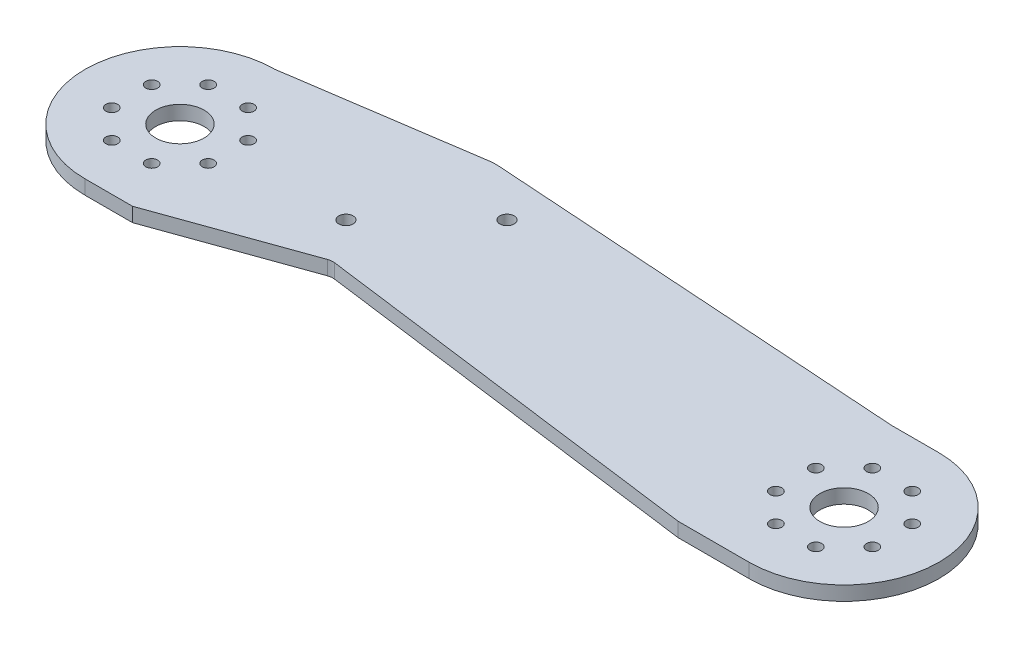
ISO-10303-21;
HEADER;
FILE_DESCRIPTION(('STEP AP214'),'2;1');
FILE_NAME('part.step','',(''),(''),'','','');
FILE_SCHEMA(('AUTOMOTIVE_DESIGN { 1 0 10303 214 1 1 1 1 }'));
ENDSEC;
DATA;
#1=APPLICATION_CONTEXT('core data for automotive mechanical design processes');
#2=APPLICATION_PROTOCOL_DEFINITION('international standard','automotive_design',2000,#1);
#3=PRODUCT_CONTEXT('',#1,'mechanical');
#4=PRODUCT('Part','Part','',(#3));
#5=PRODUCT_RELATED_PRODUCT_CATEGORY('part','',(#4));
#6=PRODUCT_DEFINITION_FORMATION('','',#4);
#7=PRODUCT_DEFINITION_CONTEXT('part definition',#1,'design');
#8=PRODUCT_DEFINITION('design','',#6,#7);
#9=PRODUCT_DEFINITION_SHAPE('','',#8);
#10=(LENGTH_UNIT() NAMED_UNIT(*) SI_UNIT(.MILLI.,.METRE.));
#11=(NAMED_UNIT(*) PLANE_ANGLE_UNIT() SI_UNIT($,.RADIAN.));
#12=(NAMED_UNIT(*) SI_UNIT($,.STERADIAN.) SOLID_ANGLE_UNIT());
#13=UNCERTAINTY_MEASURE_WITH_UNIT(LENGTH_MEASURE(1.E-05),#10,'distance_accuracy_value','');
#14=(GEOMETRIC_REPRESENTATION_CONTEXT(3) GLOBAL_UNCERTAINTY_ASSIGNED_CONTEXT((#13)) GLOBAL_UNIT_ASSIGNED_CONTEXT((#10,
#11,#12)) REPRESENTATION_CONTEXT('',''));
#15=CARTESIAN_POINT('',(0.,0.,0.));
#16=DIRECTION('',(0.,0.,1.));
#17=DIRECTION('',(1.,0.,0.));
#18=AXIS2_PLACEMENT_3D('',#15,#16,#17);
#19=CARTESIAN_POINT('',(-28.75,3.,11.9926406871193));
#20=DIRECTION('',(0.,1.,0.));
#21=DIRECTION('',(0.,0.,1.));
#22=AXIS2_PLACEMENT_3D('',#19,#20,#21);
#23=CYLINDRICAL_SURFACE('',#22,3.);
#24=CARTESIAN_POINT('',(-28.75,3.,11.9926406871193));
#25=DIRECTION('',(0.,1.,0.));
#26=DIRECTION('',(0.,0.,1.));
#27=AXIS2_PLACEMENT_3D('',#24,#25,#26);
#28=CIRCLE('',#27,3.);
#29=CARTESIAN_POINT('',(-29.7616784845072,3.,9.16836969375037));
#30=VERTEX_POINT('',#29);
#31=CARTESIAN_POINT('',(-28.3581636548757,3.,9.01834005022334));
#32=VERTEX_POINT('',#31);
#33=EDGE_CURVE('E174',#30,#32,#28,.F.);
#34=ORIENTED_EDGE('',*,*,#33,.F.);
#35=DIRECTION('',(0.,-1.,0.));
#36=VECTOR('',#35,1.);
#37=CARTESIAN_POINT('',(-29.7616784845072,10.,9.16836969375037));
#38=LINE('',#37,#36);
#39=CARTESIAN_POINT('',(-29.7616784845072,0.,9.16836969375037));
#40=VERTEX_POINT('',#39);
#41=EDGE_CURVE('E147',#30,#40,#38,.T.);
#42=ORIENTED_EDGE('',*,*,#41,.T.);
#43=CARTESIAN_POINT('',(-28.75,0.,11.9926406871193));
#44=DIRECTION('',(0.,1.,0.));
#45=DIRECTION('',(0.,0.,1.));
#46=AXIS2_PLACEMENT_3D('',#43,#44,#45);
#47=CIRCLE('',#46,3.);
#48=CARTESIAN_POINT('',(-28.3581636548757,0.,9.01834005022334));
#49=VERTEX_POINT('',#48);
#50=EDGE_CURVE('E146',#49,#40,#47,.T.);
#51=ORIENTED_EDGE('',*,*,#50,.F.);
#52=DIRECTION('',(0.,1.,0.));
#53=VECTOR('',#52,1.);
#54=CARTESIAN_POINT('',(-28.3581636548757,3.,9.01834005022334));
#55=LINE('',#54,#53);
#56=EDGE_CURVE('E134',#32,#49,#55,.F.);
#57=ORIENTED_EDGE('',*,*,#56,.F.);
#58=EDGE_LOOP('',(#34,#42,#51,#57));
#59=FACE_BOUND('',#58,.T.);
#60=ADVANCED_FACE('F33',(#59),#23,.F.);
#61=CARTESIAN_POINT('',(70.,3.,0.));
#62=DIRECTION('',(0.,1.,0.));
#63=DIRECTION('',(0.,0.,1.));
#64=AXIS2_PLACEMENT_3D('',#61,#62,#63);
#65=PLANE('',#64);
#66=DIRECTION('',(0.997771070846407,0.,0.0667299796344541));
#67=VECTOR('',#66,1.);
#68=CARTESIAN_POINT('',(-29.7141952968232,3.,-26.));
#69=LINE('',#68,#67);
#70=CARTESIAN_POINT('',(-28.6393146422383,3.,-25.9281130047907));
#71=VERTEX_POINT('',#70);
#72=CARTESIAN_POINT('',(59.6667223576861,3.,-20.0222892915359));
#73=VERTEX_POINT('',#72);
#74=EDGE_CURVE('E206',#71,#73,#69,.T.);
#75=ORIENTED_EDGE('',*,*,#74,.F.);
#76=CARTESIAN_POINT('',(-29.3066144385829,3.,-15.9504022963266));
#77=DIRECTION('',(0.,1.,0.));
#78=DIRECTION('',(0.,0.,1.));
#79=AXIS2_PLACEMENT_3D('',#76,#77,#78);
#80=CIRCLE('',#79,10.);
#81=CARTESIAN_POINT('',(-30.7797242349632,3.,-25.8413045568794));
#82=VERTEX_POINT('',#81);
#83=EDGE_CURVE('E56',#71,#82,#80,.T.);
#84=ORIENTED_EDGE('',*,*,#83,.T.);
#85=DIRECTION('',(0.989090226055278,0.,-0.14731097963804));
#86=VECTOR('',#85,1.);
#87=CARTESIAN_POINT('',(-69.9999999999998,3.,-20.));
#88=LINE('',#87,#86);
#89=CARTESIAN_POINT('',(-69.9999999999998,3.,-20.));
#90=VERTEX_POINT('',#89);
#91=EDGE_CURVE('E211',#90,#82,#88,.T.);
#92=ORIENTED_EDGE('',*,*,#91,.F.);
#93=CARTESIAN_POINT('',(-70.,3.,0.));
#94=DIRECTION('',(0.,1.,0.));
#95=DIRECTION('',(0.,0.,-1.));
#96=AXIS2_PLACEMENT_3D('',#93,#94,#95);
#97=CIRCLE('',#96,20.);
#98=CARTESIAN_POINT('',(-70.,3.,20.));
#99=VERTEX_POINT('',#98);
#100=EDGE_CURVE('E346',#90,#99,#97,.T.);
#101=ORIENTED_EDGE('',*,*,#100,.T.);
#102=DIRECTION('',(1.,0.,0.));
#103=VECTOR('',#102,1.);
#104=CARTESIAN_POINT('',(-70.,3.,20.));
#105=LINE('',#104,#103);
#106=CARTESIAN_POINT('',(-60.,3.,20.));
#107=VERTEX_POINT('',#106);
#108=EDGE_CURVE('E164',#99,#107,#105,.T.);
#109=ORIENTED_EDGE('',*,*,#108,.T.);
#110=DIRECTION('',(-0.94142366445631,0.,0.337226161502416));
#111=VECTOR('',#110,1.);
#112=CARTESIAN_POINT('',(61.5656608540279,3.,-23.5458792126112));
#113=LINE('',#112,#111);
#114=EDGE_CURVE('E128',#30,#107,#113,.T.);
#115=ORIENTED_EDGE('',*,*,#114,.F.);
#116=ORIENTED_EDGE('',*,*,#33,.T.);
#117=DIRECTION('',(-0.991433545631984,0.,-0.130612115041416));
#118=VECTOR('',#117,1.);
#119=CARTESIAN_POINT('',(67.154242484706,3.,21.6012079928582));
#120=LINE('',#119,#118);
#121=CARTESIAN_POINT('',(55.,3.,20.));
#122=VERTEX_POINT('',#121);
#123=EDGE_CURVE('E220',#122,#32,#120,.T.);
#124=ORIENTED_EDGE('',*,*,#123,.F.);
#125=DIRECTION('',(1.,0.,0.));
#126=VECTOR('',#125,1.);
#127=CARTESIAN_POINT('',(-16.5,3.,20.));
#128=LINE('',#127,#126);
#129=CARTESIAN_POINT('',(70.,3.,20.));
#130=VERTEX_POINT('',#129);
#131=EDGE_CURVE('E153',#122,#130,#128,.T.);
#132=ORIENTED_EDGE('',*,*,#131,.T.);
#133=CARTESIAN_POINT('',(70.,3.,0.));
#134=DIRECTION('',(0.,1.,0.));
#135=DIRECTION('',(0.,0.,1.));
#136=AXIS2_PLACEMENT_3D('',#133,#134,#135);
#137=CIRCLE('',#136,20.);
#138=CARTESIAN_POINT('',(70.,3.,-20.));
#139=VERTEX_POINT('',#138);
#140=EDGE_CURVE('E156',#130,#139,#137,.T.);
#141=ORIENTED_EDGE('',*,*,#140,.T.);
#142=DIRECTION('',(-1.,0.,0.));
#143=VECTOR('',#142,1.);
#144=CARTESIAN_POINT('',(70.,3.,-20.));
#145=LINE('',#144,#143);
#146=CARTESIAN_POINT('',(60.3340221540306,3.,-20.));
#147=VERTEX_POINT('',#146);
#148=EDGE_CURVE('E207',#139,#147,#145,.T.);
#149=ORIENTED_EDGE('',*,*,#148,.T.);
#150=CARTESIAN_POINT('',(60.3340221540306,3.,-30.));
#151=DIRECTION('',(0.,1.,0.));
#152=DIRECTION('',(0.,0.,1.));
#153=AXIS2_PLACEMENT_3D('',#150,#151,#152);
#154=CIRCLE('',#153,10.);
#155=EDGE_CURVE('E11',#147,#73,#154,.F.);
#156=ORIENTED_EDGE('',*,*,#155,.T.);
#157=EDGE_LOOP('',(#75,#84,#92,#101,#109,#115,#116,#124,#132,#141,#149,#156));
#158=FACE_BOUND('',#157,.T.);
#159=CARTESIAN_POINT('',(-35.,3.,0.));
#160=DIRECTION('',(0.,1.,0.));
#161=DIRECTION('',(0.,0.,1.));
#162=AXIS2_PLACEMENT_3D('',#159,#160,#161);
#163=CIRCLE('',#162,1.5);
#164=CARTESIAN_POINT('',(-35.,3.,1.5));
#165=VERTEX_POINT('',#164);
#166=EDGE_CURVE('E230',#165,#165,#163,.T.);
#167=ORIENTED_EDGE('',*,*,#166,.F.);
#168=EDGE_LOOP('',(#167));
#169=FACE_BOUND('',#168,.T.);
#170=CARTESIAN_POINT('',(-59.8373251423758,3.,-4.20951775601592));
#171=DIRECTION('',(0.,1.,0.));
#172=DIRECTION('',(0.,0.,-1.));
#173=AXIS2_PLACEMENT_3D('',#170,#171,#172);
#174=CIRCLE('',#173,1.24999999999998);
#175=CARTESIAN_POINT('',(-59.8373251423758,3.,-5.4595177560159));
#176=VERTEX_POINT('',#175);
#177=EDGE_CURVE('E242',#176,#176,#174,.T.);
#178=ORIENTED_EDGE('',*,*,#177,.F.);
#179=EDGE_LOOP('',(#178));
#180=FACE_BOUND('',#179,.T.);
#181=CARTESIAN_POINT('',(-74.2095177560159,3.,-10.1626748576242));
#182=DIRECTION('',(0.,1.,0.));
#183=DIRECTION('',(0.,0.,-1.));
#184=AXIS2_PLACEMENT_3D('',#181,#182,#183);
#185=CIRCLE('',#184,1.25000000000001);
#186=CARTESIAN_POINT('',(-74.2095177560159,3.,-11.4126748576242));
#187=VERTEX_POINT('',#186);
#188=EDGE_CURVE('E254',#187,#187,#185,.T.);
#189=ORIENTED_EDGE('',*,*,#188,.F.);
#190=EDGE_LOOP('',(#189));
#191=FACE_BOUND('',#190,.T.);
#192=CARTESIAN_POINT('',(65.7904822439841,3.,10.1626748576242));
#193=DIRECTION('',(0.,1.,0.));
#194=DIRECTION('',(0.,0.,1.));
#195=AXIS2_PLACEMENT_3D('',#192,#193,#194);
#196=CIRCLE('',#195,1.24999999999997);
#197=CARTESIAN_POINT('',(65.7904822439841,3.,11.4126748576241));
#198=VERTEX_POINT('',#197);
#199=EDGE_CURVE('E266',#198,#198,#196,.T.);
#200=ORIENTED_EDGE('',*,*,#199,.F.);
#201=EDGE_LOOP('',(#200));
#202=FACE_BOUND('',#201,.T.);
#203=CARTESIAN_POINT('',(-80.1626748576242,3.,4.20951775601592));
#204=DIRECTION('',(0.,1.,0.));
#205=DIRECTION('',(0.,0.,-1.));
#206=AXIS2_PLACEMENT_3D('',#203,#204,#205);
#207=CIRCLE('',#206,1.25000000000001);
#208=CARTESIAN_POINT('',(-80.1626748576242,3.,2.95951775601591));
#209=VERTEX_POINT('',#208);
#210=EDGE_CURVE('E278',#209,#209,#207,.T.);
#211=ORIENTED_EDGE('',*,*,#210,.F.);
#212=EDGE_LOOP('',(#211));
#213=FACE_BOUND('',#212,.T.);
#214=CARTESIAN_POINT('',(-65.7904822439841,3.,10.1626748576242));
#215=DIRECTION('',(0.,1.,0.));
#216=DIRECTION('',(0.,0.,-1.));
#217=AXIS2_PLACEMENT_3D('',#214,#215,#216);
#218=CIRCLE('',#217,1.24999999999997);
#219=CARTESIAN_POINT('',(-65.7904822439841,3.,8.91267485762421));
#220=VERTEX_POINT('',#219);
#221=EDGE_CURVE('E290',#220,#220,#218,.T.);
#222=ORIENTED_EDGE('',*,*,#221,.F.);
#223=EDGE_LOOP('',(#222));
#224=FACE_BOUND('',#223,.T.);
#225=CARTESIAN_POINT('',(74.2095177560161,3.,10.1626748576241));
#226=DIRECTION('',(0.,1.,0.));
#227=DIRECTION('',(0.,0.,1.));
#228=AXIS2_PLACEMENT_3D('',#225,#226,#227);
#229=CIRCLE('',#228,1.25000000000001);
#230=CARTESIAN_POINT('',(74.2095177560161,3.,11.4126748576241));
#231=VERTEX_POINT('',#230);
#232=EDGE_CURVE('E302',#231,#231,#229,.T.);
#233=ORIENTED_EDGE('',*,*,#232,.F.);
#234=EDGE_LOOP('',(#233));
#235=FACE_BOUND('',#234,.T.);
#236=CARTESIAN_POINT('',(80.1626748576241,3.,-4.20951775601604));
#237=DIRECTION('',(0.,1.,0.));
#238=DIRECTION('',(0.,0.,1.));
#239=AXIS2_PLACEMENT_3D('',#236,#237,#238);
#240=CIRCLE('',#239,1.25000000000004);
#241=CARTESIAN_POINT('',(80.1626748576241,3.,-2.959517756016));
#242=VERTEX_POINT('',#241);
#243=EDGE_CURVE('E314',#242,#242,#240,.T.);
#244=ORIENTED_EDGE('',*,*,#243,.F.);
#245=EDGE_LOOP('',(#244));
#246=FACE_BOUND('',#245,.T.);
#247=CARTESIAN_POINT('',(65.790482243984,3.,-10.1626748576241));
#248=DIRECTION('',(0.,1.,0.));
#249=DIRECTION('',(0.,0.,1.));
#250=AXIS2_PLACEMENT_3D('',#247,#248,#249);
#251=CIRCLE('',#250,1.25000000000001);
#252=CARTESIAN_POINT('',(65.790482243984,3.,-8.91267485762411));
#253=VERTEX_POINT('',#252);
#254=EDGE_CURVE('E326',#253,#253,#251,.T.);
#255=ORIENTED_EDGE('',*,*,#254,.F.);
#256=EDGE_LOOP('',(#255));
#257=FACE_BOUND('',#256,.T.);
#258=CARTESIAN_POINT('',(70.,3.,0.));
#259=DIRECTION('',(0.,1.,0.));
#260=DIRECTION('',(0.,0.,1.));
#261=AXIS2_PLACEMENT_3D('',#258,#259,#260);
#262=CIRCLE('',#261,5.09999999999998);
#263=CARTESIAN_POINT('',(70.,3.,5.09999999999998));
#264=VERTEX_POINT('',#263);
#265=EDGE_CURVE('E338',#264,#264,#262,.T.);
#266=ORIENTED_EDGE('',*,*,#265,.F.);
#267=EDGE_LOOP('',(#266));
#268=FACE_BOUND('',#267,.T.);
#269=CARTESIAN_POINT('',(59.8373251423758,3.,-4.20951775601592));
#270=DIRECTION('',(0.,1.,0.));
#271=DIRECTION('',(0.,0.,1.));
#272=AXIS2_PLACEMENT_3D('',#269,#270,#271);
#273=CIRCLE('',#272,1.24999999999998);
#274=CARTESIAN_POINT('',(59.8373251423758,3.,-2.95951775601594));
#275=VERTEX_POINT('',#274);
#276=EDGE_CURVE('E332',#275,#275,#273,.T.);
#277=ORIENTED_EDGE('',*,*,#276,.F.);
#278=EDGE_LOOP('',(#277));
#279=FACE_BOUND('',#278,.T.);
#280=CARTESIAN_POINT('',(74.2095177560159,3.,-10.1626748576242));
#281=DIRECTION('',(0.,1.,0.));
#282=DIRECTION('',(0.,0.,1.));
#283=AXIS2_PLACEMENT_3D('',#280,#281,#282);
#284=CIRCLE('',#283,1.25000000000001);
#285=CARTESIAN_POINT('',(74.2095177560159,3.,-8.91267485762416));
#286=VERTEX_POINT('',#285);
#287=EDGE_CURVE('E320',#286,#286,#284,.T.);
#288=ORIENTED_EDGE('',*,*,#287,.F.);
#289=EDGE_LOOP('',(#288));
#290=FACE_BOUND('',#289,.T.);
#291=CARTESIAN_POINT('',(80.1626748576242,3.,4.20951775601592));
#292=DIRECTION('',(0.,1.,0.));
#293=DIRECTION('',(0.,0.,1.));
#294=AXIS2_PLACEMENT_3D('',#291,#292,#293);
#295=CIRCLE('',#294,1.25000000000001);
#296=CARTESIAN_POINT('',(80.1626748576242,3.,5.45951775601593));
#297=VERTEX_POINT('',#296);
#298=EDGE_CURVE('E308',#297,#297,#295,.T.);
#299=ORIENTED_EDGE('',*,*,#298,.F.);
#300=EDGE_LOOP('',(#299));
#301=FACE_BOUND('',#300,.T.);
#302=CARTESIAN_POINT('',(-59.8373251423759,3.,4.20951775601605));
#303=DIRECTION('',(0.,1.,0.));
#304=DIRECTION('',(0.,0.,-1.));
#305=AXIS2_PLACEMENT_3D('',#302,#303,#304);
#306=CIRCLE('',#305,1.24999999999998);
#307=CARTESIAN_POINT('',(-59.8373251423759,3.,2.95951775601607));
#308=VERTEX_POINT('',#307);
#309=EDGE_CURVE('E296',#308,#308,#306,.T.);
#310=ORIENTED_EDGE('',*,*,#309,.F.);
#311=EDGE_LOOP('',(#310));
#312=FACE_BOUND('',#311,.T.);
#313=CARTESIAN_POINT('',(-74.2095177560161,3.,10.1626748576241));
#314=DIRECTION('',(0.,1.,0.));
#315=DIRECTION('',(0.,0.,-1.));
#316=AXIS2_PLACEMENT_3D('',#313,#314,#315);
#317=CIRCLE('',#316,1.25000000000001);
#318=CARTESIAN_POINT('',(-74.2095177560161,3.,8.91267485762411));
#319=VERTEX_POINT('',#318);
#320=EDGE_CURVE('E284',#319,#319,#317,.T.);
#321=ORIENTED_EDGE('',*,*,#320,.F.);
#322=EDGE_LOOP('',(#321));
#323=FACE_BOUND('',#322,.T.);
#324=CARTESIAN_POINT('',(-80.1626748576241,3.,-4.20951775601604));
#325=DIRECTION('',(0.,1.,0.));
#326=DIRECTION('',(0.,0.,-1.));
#327=AXIS2_PLACEMENT_3D('',#324,#325,#326);
#328=CIRCLE('',#327,1.25000000000004);
#329=CARTESIAN_POINT('',(-80.1626748576241,3.,-5.45951775601608));
#330=VERTEX_POINT('',#329);
#331=EDGE_CURVE('E272',#330,#330,#328,.T.);
#332=ORIENTED_EDGE('',*,*,#331,.F.);
#333=EDGE_LOOP('',(#332));
#334=FACE_BOUND('',#333,.T.);
#335=CARTESIAN_POINT('',(59.8373251423759,3.,4.20951775601605));
#336=DIRECTION('',(0.,1.,0.));
#337=DIRECTION('',(0.,0.,1.));
#338=AXIS2_PLACEMENT_3D('',#335,#336,#337);
#339=CIRCLE('',#338,1.24999999999998);
#340=CARTESIAN_POINT('',(59.8373251423759,3.,5.45951775601603));
#341=VERTEX_POINT('',#340);
#342=EDGE_CURVE('E260',#341,#341,#339,.T.);
#343=ORIENTED_EDGE('',*,*,#342,.F.);
#344=EDGE_LOOP('',(#343));
#345=FACE_BOUND('',#344,.T.);
#346=CARTESIAN_POINT('',(-65.790482243984,3.,-10.1626748576241));
#347=DIRECTION('',(0.,1.,0.));
#348=DIRECTION('',(0.,0.,-1.));
#349=AXIS2_PLACEMENT_3D('',#346,#347,#348);
#350=CIRCLE('',#349,1.25000000000001);
#351=CARTESIAN_POINT('',(-65.790482243984,3.,-11.4126748576241));
#352=VERTEX_POINT('',#351);
#353=EDGE_CURVE('E248',#352,#352,#350,.T.);
#354=ORIENTED_EDGE('',*,*,#353,.F.);
#355=EDGE_LOOP('',(#354));
#356=FACE_BOUND('',#355,.T.);
#357=CARTESIAN_POINT('',(-70.,3.,0.));
#358=DIRECTION('',(0.,1.,0.));
#359=DIRECTION('',(0.,0.,-1.));
#360=AXIS2_PLACEMENT_3D('',#357,#358,#359);
#361=CIRCLE('',#360,5.09999999999998);
#362=CARTESIAN_POINT('',(-70.,3.,-5.09999999999998));
#363=VERTEX_POINT('',#362);
#364=EDGE_CURVE('E236',#363,#363,#361,.T.);
#365=ORIENTED_EDGE('',*,*,#364,.F.);
#366=EDGE_LOOP('',(#365));
#367=FACE_BOUND('',#366,.T.);
#368=CARTESIAN_POINT('',(-18.0294372515229,3.,-16.9705627484772));
#369=DIRECTION('',(0.,1.,0.));
#370=DIRECTION('',(0.,0.,1.));
#371=AXIS2_PLACEMENT_3D('',#368,#369,#370);
#372=CIRCLE('',#371,1.5);
#373=CARTESIAN_POINT('',(-18.0294372515229,3.,-15.4705627484772));
#374=VERTEX_POINT('',#373);
#375=EDGE_CURVE('E224',#374,#374,#372,.T.);
#376=ORIENTED_EDGE('',*,*,#375,.F.);
#377=EDGE_LOOP('',(#376));
#378=FACE_BOUND('',#377,.T.);
#379=ADVANCED_FACE('F204',(#158,#169,#180,#191,#202,#213,#224,#235,#246,#257,#268,#279,#290,
#301,#312,#323,#334,#345,#356,#367,#378),#65,.T.);
#380=CARTESIAN_POINT('',(70.,0.,0.));
#381=DIRECTION('',(0.,1.,0.));
#382=DIRECTION('',(0.,0.,1.));
#383=AXIS2_PLACEMENT_3D('',#380,#381,#382);
#384=PLANE('',#383);
#385=DIRECTION('',(0.989090226055278,0.,-0.147310979638039));
#386=VECTOR('',#385,1.);
#387=CARTESIAN_POINT('',(-69.9999999999998,0.,-20.));
#388=LINE('',#387,#386);
#389=CARTESIAN_POINT('',(-70.,0.,-20.));
#390=VERTEX_POINT('',#389);
#391=CARTESIAN_POINT('',(-30.7797242349633,0.,-25.8413045568794));
#392=VERTEX_POINT('',#391);
#393=EDGE_CURVE('E365',#390,#392,#388,.T.);
#394=ORIENTED_EDGE('',*,*,#393,.T.);
#395=CARTESIAN_POINT('',(-29.3066144385829,0.,-15.9504022963266));
#396=DIRECTION('',(0.,1.,0.));
#397=DIRECTION('',(0.,0.,1.));
#398=AXIS2_PLACEMENT_3D('',#395,#396,#397);
#399=CIRCLE('',#398,10.);
#400=CARTESIAN_POINT('',(-28.6393146422383,0.,-25.9281130047907));
#401=VERTEX_POINT('',#400);
#402=EDGE_CURVE('E48',#392,#401,#399,.F.);
#403=ORIENTED_EDGE('',*,*,#402,.T.);
#404=DIRECTION('',(0.997771070846407,0.,0.0667299796344541));
#405=VECTOR('',#404,1.);
#406=CARTESIAN_POINT('',(-29.7141952968232,0.,-26.));
#407=LINE('',#406,#405);
#408=CARTESIAN_POINT('',(59.666722357686,0.,-20.0222892915359));
#409=VERTEX_POINT('',#408);
#410=EDGE_CURVE('E191',#401,#409,#407,.T.);
#411=ORIENTED_EDGE('',*,*,#410,.T.);
#412=CARTESIAN_POINT('',(60.3340221540306,0.,-30.));
#413=DIRECTION('',(0.,1.,0.));
#414=DIRECTION('',(0.,0.,1.));
#415=AXIS2_PLACEMENT_3D('',#412,#413,#414);
#416=CIRCLE('',#415,10.);
#417=CARTESIAN_POINT('',(60.3340221540306,0.,-20.));
#418=VERTEX_POINT('',#417);
#419=EDGE_CURVE('E41',#409,#418,#416,.T.);
#420=ORIENTED_EDGE('',*,*,#419,.T.);
#421=DIRECTION('',(-1.,0.,0.));
#422=VECTOR('',#421,1.);
#423=CARTESIAN_POINT('',(70.,0.,-20.));
#424=LINE('',#423,#422);
#425=CARTESIAN_POINT('',(70.,0.,-20.));
#426=VERTEX_POINT('',#425);
#427=EDGE_CURVE('E158',#426,#418,#424,.T.);
#428=ORIENTED_EDGE('',*,*,#427,.F.);
#429=CARTESIAN_POINT('',(70.,0.,0.));
#430=DIRECTION('',(0.,1.,0.));
#431=DIRECTION('',(0.,0.,1.));
#432=AXIS2_PLACEMENT_3D('',#429,#430,#431);
#433=CIRCLE('',#432,20.);
#434=CARTESIAN_POINT('',(70.,0.,20.));
#435=VERTEX_POINT('',#434);
#436=EDGE_CURVE('E200',#435,#426,#433,.T.);
#437=ORIENTED_EDGE('',*,*,#436,.F.);
#438=DIRECTION('',(1.,0.,0.));
#439=VECTOR('',#438,1.);
#440=CARTESIAN_POINT('',(-16.5,0.,20.));
#441=LINE('',#440,#439);
#442=CARTESIAN_POINT('',(55.,0.,20.));
#443=VERTEX_POINT('',#442);
#444=EDGE_CURVE('E341',#443,#435,#441,.T.);
#445=ORIENTED_EDGE('',*,*,#444,.F.);
#446=DIRECTION('',(0.991433545631984,0.,0.130612115041416));
#447=VECTOR('',#446,1.);
#448=CARTESIAN_POINT('',(-28.3581636548757,0.,9.01834005022334));
#449=LINE('',#448,#447);
#450=EDGE_CURVE('E210',#49,#443,#449,.T.);
#451=ORIENTED_EDGE('',*,*,#450,.F.);
#452=ORIENTED_EDGE('',*,*,#50,.T.);
#453=DIRECTION('',(0.94142366445631,0.,-0.337226161502416));
#454=VECTOR('',#453,1.);
#455=CARTESIAN_POINT('',(-29.7616784845072,0.,9.16836969375037));
#456=LINE('',#455,#454);
#457=CARTESIAN_POINT('',(-60.,0.,20.));
#458=VERTEX_POINT('',#457);
#459=EDGE_CURVE('E125',#458,#40,#456,.T.);
#460=ORIENTED_EDGE('',*,*,#459,.F.);
#461=DIRECTION('',(1.,0.,0.));
#462=VECTOR('',#461,1.);
#463=CARTESIAN_POINT('',(-70.,0.,20.));
#464=LINE('',#463,#462);
#465=CARTESIAN_POINT('',(-70.,0.,20.));
#466=VERTEX_POINT('',#465);
#467=EDGE_CURVE('E143',#466,#458,#464,.T.);
#468=ORIENTED_EDGE('',*,*,#467,.F.);
#469=CARTESIAN_POINT('',(-70.,0.,0.));
#470=DIRECTION('',(0.,1.,0.));
#471=DIRECTION('',(0.,0.,-1.));
#472=AXIS2_PLACEMENT_3D('',#469,#470,#471);
#473=CIRCLE('',#472,20.);
#474=EDGE_CURVE('E154',#390,#466,#473,.T.);
#475=ORIENTED_EDGE('',*,*,#474,.F.);
#476=EDGE_LOOP('',(#394,#403,#411,#420,#428,#437,#445,#451,#452,#460,#468,#475));
#477=FACE_BOUND('',#476,.T.);
#478=CARTESIAN_POINT('',(70.,0.,0.));
#479=DIRECTION('',(0.,1.,0.));
#480=DIRECTION('',(0.,0.,1.));
#481=AXIS2_PLACEMENT_3D('',#478,#479,#480);
#482=CIRCLE('',#481,5.09999999999998);
#483=CARTESIAN_POINT('',(70.,0.,5.09999999999998));
#484=VERTEX_POINT('',#483);
#485=EDGE_CURVE('E335',#484,#484,#482,.T.);
#486=ORIENTED_EDGE('',*,*,#485,.T.);
#487=EDGE_LOOP('',(#486));
#488=FACE_BOUND('',#487,.T.);
#489=CARTESIAN_POINT('',(59.8373251423758,0.,-4.20951775601592));
#490=DIRECTION('',(0.,1.,0.));
#491=DIRECTION('',(0.,0.,1.));
#492=AXIS2_PLACEMENT_3D('',#489,#490,#491);
#493=CIRCLE('',#492,1.24999999999998);
#494=CARTESIAN_POINT('',(59.8373251423758,0.,-2.95951775601594));
#495=VERTEX_POINT('',#494);
#496=EDGE_CURVE('E329',#495,#495,#493,.T.);
#497=ORIENTED_EDGE('',*,*,#496,.T.);
#498=EDGE_LOOP('',(#497));
#499=FACE_BOUND('',#498,.T.);
#500=CARTESIAN_POINT('',(65.790482243984,0.,-10.1626748576241));
#501=DIRECTION('',(0.,1.,0.));
#502=DIRECTION('',(0.,0.,1.));
#503=AXIS2_PLACEMENT_3D('',#500,#501,#502);
#504=CIRCLE('',#503,1.25000000000001);
#505=CARTESIAN_POINT('',(65.790482243984,0.,-8.91267485762411));
#506=VERTEX_POINT('',#505);
#507=EDGE_CURVE('E323',#506,#506,#504,.T.);
#508=ORIENTED_EDGE('',*,*,#507,.T.);
#509=EDGE_LOOP('',(#508));
#510=FACE_BOUND('',#509,.T.);
#511=CARTESIAN_POINT('',(74.2095177560159,0.,-10.1626748576242));
#512=DIRECTION('',(0.,1.,0.));
#513=DIRECTION('',(0.,0.,1.));
#514=AXIS2_PLACEMENT_3D('',#511,#512,#513);
#515=CIRCLE('',#514,1.25000000000001);
#516=CARTESIAN_POINT('',(74.2095177560159,0.,-8.91267485762416));
#517=VERTEX_POINT('',#516);
#518=EDGE_CURVE('E317',#517,#517,#515,.T.);
#519=ORIENTED_EDGE('',*,*,#518,.T.);
#520=EDGE_LOOP('',(#519));
#521=FACE_BOUND('',#520,.T.);
#522=CARTESIAN_POINT('',(80.1626748576241,0.,-4.20951775601604));
#523=DIRECTION('',(0.,1.,0.));
#524=DIRECTION('',(0.,0.,1.));
#525=AXIS2_PLACEMENT_3D('',#522,#523,#524);
#526=CIRCLE('',#525,1.25000000000004);
#527=CARTESIAN_POINT('',(80.1626748576241,0.,-2.959517756016));
#528=VERTEX_POINT('',#527);
#529=EDGE_CURVE('E311',#528,#528,#526,.T.);
#530=ORIENTED_EDGE('',*,*,#529,.T.);
#531=EDGE_LOOP('',(#530));
#532=FACE_BOUND('',#531,.T.);
#533=CARTESIAN_POINT('',(80.1626748576242,0.,4.20951775601592));
#534=DIRECTION('',(0.,1.,0.));
#535=DIRECTION('',(0.,0.,1.));
#536=AXIS2_PLACEMENT_3D('',#533,#534,#535);
#537=CIRCLE('',#536,1.25000000000001);
#538=CARTESIAN_POINT('',(80.1626748576242,0.,5.45951775601593));
#539=VERTEX_POINT('',#538);
#540=EDGE_CURVE('E305',#539,#539,#537,.T.);
#541=ORIENTED_EDGE('',*,*,#540,.T.);
#542=EDGE_LOOP('',(#541));
#543=FACE_BOUND('',#542,.T.);
#544=CARTESIAN_POINT('',(74.2095177560161,0.,10.1626748576241));
#545=DIRECTION('',(0.,1.,0.));
#546=DIRECTION('',(0.,0.,1.));
#547=AXIS2_PLACEMENT_3D('',#544,#545,#546);
#548=CIRCLE('',#547,1.25000000000001);
#549=CARTESIAN_POINT('',(74.2095177560161,0.,11.4126748576241));
#550=VERTEX_POINT('',#549);
#551=EDGE_CURVE('E299',#550,#550,#548,.T.);
#552=ORIENTED_EDGE('',*,*,#551,.T.);
#553=EDGE_LOOP('',(#552));
#554=FACE_BOUND('',#553,.T.);
#555=CARTESIAN_POINT('',(-59.8373251423759,0.,4.20951775601605));
#556=DIRECTION('',(0.,1.,0.));
#557=DIRECTION('',(0.,0.,-1.));
#558=AXIS2_PLACEMENT_3D('',#555,#556,#557);
#559=CIRCLE('',#558,1.24999999999998);
#560=CARTESIAN_POINT('',(-59.8373251423759,0.,2.95951775601607));
#561=VERTEX_POINT('',#560);
#562=EDGE_CURVE('E293',#561,#561,#559,.T.);
#563=ORIENTED_EDGE('',*,*,#562,.T.);
#564=EDGE_LOOP('',(#563));
#565=FACE_BOUND('',#564,.T.);
#566=CARTESIAN_POINT('',(-65.7904822439841,0.,10.1626748576242));
#567=DIRECTION('',(0.,1.,0.));
#568=DIRECTION('',(0.,0.,-1.));
#569=AXIS2_PLACEMENT_3D('',#566,#567,#568);
#570=CIRCLE('',#569,1.24999999999997);
#571=CARTESIAN_POINT('',(-65.7904822439841,0.,8.91267485762421));
#572=VERTEX_POINT('',#571);
#573=EDGE_CURVE('E287',#572,#572,#570,.T.);
#574=ORIENTED_EDGE('',*,*,#573,.T.);
#575=EDGE_LOOP('',(#574));
#576=FACE_BOUND('',#575,.T.);
#577=CARTESIAN_POINT('',(-74.2095177560161,0.,10.1626748576241));
#578=DIRECTION('',(0.,1.,0.));
#579=DIRECTION('',(0.,0.,-1.));
#580=AXIS2_PLACEMENT_3D('',#577,#578,#579);
#581=CIRCLE('',#580,1.25000000000001);
#582=CARTESIAN_POINT('',(-74.2095177560161,0.,8.91267485762411));
#583=VERTEX_POINT('',#582);
#584=EDGE_CURVE('E281',#583,#583,#581,.T.);
#585=ORIENTED_EDGE('',*,*,#584,.T.);
#586=EDGE_LOOP('',(#585));
#587=FACE_BOUND('',#586,.T.);
#588=CARTESIAN_POINT('',(-80.1626748576242,0.,4.20951775601592));
#589=DIRECTION('',(0.,1.,0.));
#590=DIRECTION('',(0.,0.,-1.));
#591=AXIS2_PLACEMENT_3D('',#588,#589,#590);
#592=CIRCLE('',#591,1.25000000000001);
#593=CARTESIAN_POINT('',(-80.1626748576242,0.,2.95951775601591));
#594=VERTEX_POINT('',#593);
#595=EDGE_CURVE('E275',#594,#594,#592,.T.);
#596=ORIENTED_EDGE('',*,*,#595,.T.);
#597=EDGE_LOOP('',(#596));
#598=FACE_BOUND('',#597,.T.);
#599=CARTESIAN_POINT('',(-80.1626748576241,0.,-4.20951775601604));
#600=DIRECTION('',(0.,1.,0.));
#601=DIRECTION('',(0.,0.,-1.));
#602=AXIS2_PLACEMENT_3D('',#599,#600,#601);
#603=CIRCLE('',#602,1.25000000000004);
#604=CARTESIAN_POINT('',(-80.1626748576241,0.,-5.45951775601608));
#605=VERTEX_POINT('',#604);
#606=EDGE_CURVE('E269',#605,#605,#603,.T.);
#607=ORIENTED_EDGE('',*,*,#606,.T.);
#608=EDGE_LOOP('',(#607));
#609=FACE_BOUND('',#608,.T.);
#610=CARTESIAN_POINT('',(65.7904822439841,0.,10.1626748576242));
#611=DIRECTION('',(0.,1.,0.));
#612=DIRECTION('',(0.,0.,1.));
#613=AXIS2_PLACEMENT_3D('',#610,#611,#612);
#614=CIRCLE('',#613,1.24999999999997);
#615=CARTESIAN_POINT('',(65.7904822439841,0.,11.4126748576241));
#616=VERTEX_POINT('',#615);
#617=EDGE_CURVE('E263',#616,#616,#614,.T.);
#618=ORIENTED_EDGE('',*,*,#617,.T.);
#619=EDGE_LOOP('',(#618));
#620=FACE_BOUND('',#619,.T.);
#621=CARTESIAN_POINT('',(59.8373251423759,0.,4.20951775601605));
#622=DIRECTION('',(0.,1.,0.));
#623=DIRECTION('',(0.,0.,1.));
#624=AXIS2_PLACEMENT_3D('',#621,#622,#623);
#625=CIRCLE('',#624,1.24999999999998);
#626=CARTESIAN_POINT('',(59.8373251423759,0.,5.45951775601603));
#627=VERTEX_POINT('',#626);
#628=EDGE_CURVE('E257',#627,#627,#625,.T.);
#629=ORIENTED_EDGE('',*,*,#628,.T.);
#630=EDGE_LOOP('',(#629));
#631=FACE_BOUND('',#630,.T.);
#632=CARTESIAN_POINT('',(-74.2095177560159,0.,-10.1626748576242));
#633=DIRECTION('',(0.,1.,0.));
#634=DIRECTION('',(0.,0.,-1.));
#635=AXIS2_PLACEMENT_3D('',#632,#633,#634);
#636=CIRCLE('',#635,1.25000000000001);
#637=CARTESIAN_POINT('',(-74.2095177560159,0.,-11.4126748576242));
#638=VERTEX_POINT('',#637);
#639=EDGE_CURVE('E251',#638,#638,#636,.T.);
#640=ORIENTED_EDGE('',*,*,#639,.T.);
#641=EDGE_LOOP('',(#640));
#642=FACE_BOUND('',#641,.T.);
#643=CARTESIAN_POINT('',(-65.790482243984,0.,-10.1626748576241));
#644=DIRECTION('',(0.,1.,0.));
#645=DIRECTION('',(0.,0.,-1.));
#646=AXIS2_PLACEMENT_3D('',#643,#644,#645);
#647=CIRCLE('',#646,1.25000000000001);
#648=CARTESIAN_POINT('',(-65.790482243984,0.,-11.4126748576241));
#649=VERTEX_POINT('',#648);
#650=EDGE_CURVE('E245',#649,#649,#647,.T.);
#651=ORIENTED_EDGE('',*,*,#650,.T.);
#652=EDGE_LOOP('',(#651));
#653=FACE_BOUND('',#652,.T.);
#654=CARTESIAN_POINT('',(-59.8373251423758,0.,-4.20951775601592));
#655=DIRECTION('',(0.,1.,0.));
#656=DIRECTION('',(0.,0.,-1.));
#657=AXIS2_PLACEMENT_3D('',#654,#655,#656);
#658=CIRCLE('',#657,1.24999999999998);
#659=CARTESIAN_POINT('',(-59.8373251423758,0.,-5.4595177560159));
#660=VERTEX_POINT('',#659);
#661=EDGE_CURVE('E239',#660,#660,#658,.T.);
#662=ORIENTED_EDGE('',*,*,#661,.T.);
#663=EDGE_LOOP('',(#662));
#664=FACE_BOUND('',#663,.T.);
#665=CARTESIAN_POINT('',(-70.,0.,0.));
#666=DIRECTION('',(0.,1.,0.));
#667=DIRECTION('',(0.,0.,-1.));
#668=AXIS2_PLACEMENT_3D('',#665,#666,#667);
#669=CIRCLE('',#668,5.09999999999998);
#670=CARTESIAN_POINT('',(-70.,0.,-5.09999999999998));
#671=VERTEX_POINT('',#670);
#672=EDGE_CURVE('E233',#671,#671,#669,.T.);
#673=ORIENTED_EDGE('',*,*,#672,.T.);
#674=EDGE_LOOP('',(#673));
#675=FACE_BOUND('',#674,.T.);
#676=CARTESIAN_POINT('',(-35.,0.,0.));
#677=DIRECTION('',(0.,1.,0.));
#678=DIRECTION('',(0.,0.,1.));
#679=AXIS2_PLACEMENT_3D('',#676,#677,#678);
#680=CIRCLE('',#679,1.5);
#681=CARTESIAN_POINT('',(-35.,0.,1.5));
#682=VERTEX_POINT('',#681);
#683=EDGE_CURVE('E227',#682,#682,#680,.T.);
#684=ORIENTED_EDGE('',*,*,#683,.T.);
#685=EDGE_LOOP('',(#684));
#686=FACE_BOUND('',#685,.T.);
#687=CARTESIAN_POINT('',(-18.0294372515229,0.,-16.9705627484772));
#688=DIRECTION('',(0.,1.,0.));
#689=DIRECTION('',(0.,0.,1.));
#690=AXIS2_PLACEMENT_3D('',#687,#688,#689);
#691=CIRCLE('',#690,1.5);
#692=CARTESIAN_POINT('',(-18.0294372515229,0.,-15.4705627484772));
#693=VERTEX_POINT('',#692);
#694=EDGE_CURVE('E223',#693,#693,#691,.T.);
#695=ORIENTED_EDGE('',*,*,#694,.T.);
#696=EDGE_LOOP('',(#695));
#697=FACE_BOUND('',#696,.T.);
#698=ADVANCED_FACE('F140',(#477,#488,#499,#510,#521,#532,#543,#554,#565,#576,#587,#598,#609,
#620,#631,#642,#653,#664,#675,#686,#697),#384,.F.);
#699=CARTESIAN_POINT('',(-16.5,3.,20.));
#700=DIRECTION('',(0.,0.,-1.));
#701=DIRECTION('',(-1.,0.,0.));
#702=AXIS2_PLACEMENT_3D('',#699,#700,#701);
#703=PLANE('',#702);
#704=ORIENTED_EDGE('',*,*,#131,.F.);
#705=DIRECTION('',(0.,-1.,0.));
#706=VECTOR('',#705,1.);
#707=CARTESIAN_POINT('',(55.,10.,20.));
#708=LINE('',#707,#706);
#709=EDGE_CURVE('E213',#122,#443,#708,.T.);
#710=ORIENTED_EDGE('',*,*,#709,.T.);
#711=ORIENTED_EDGE('',*,*,#444,.T.);
#712=DIRECTION('',(0.,-1.,0.));
#713=VECTOR('',#712,1.);
#714=CARTESIAN_POINT('',(70.,3.,20.));
#715=LINE('',#714,#713);
#716=EDGE_CURVE('E170',#130,#435,#715,.T.);
#717=ORIENTED_EDGE('',*,*,#716,.F.);
#718=EDGE_LOOP('',(#704,#710,#711,#717));
#719=FACE_BOUND('',#718,.T.);
#720=ADVANCED_FACE('F357',(#719),#703,.F.);
#721=CARTESIAN_POINT('',(70.,3.,0.));
#722=DIRECTION('',(0.,-1.,0.));
#723=DIRECTION('',(0.,0.,-1.));
#724=AXIS2_PLACEMENT_3D('',#721,#722,#723);
#725=CYLINDRICAL_SURFACE('',#724,20.);
#726=ORIENTED_EDGE('',*,*,#436,.T.);
#727=DIRECTION('',(0.,-1.,0.));
#728=VECTOR('',#727,1.);
#729=CARTESIAN_POINT('',(70.,3.,-20.));
#730=LINE('',#729,#728);
#731=EDGE_CURVE('E167',#139,#426,#730,.T.);
#732=ORIENTED_EDGE('',*,*,#731,.F.);
#733=ORIENTED_EDGE('',*,*,#140,.F.);
#734=ORIENTED_EDGE('',*,*,#716,.T.);
#735=EDGE_LOOP('',(#726,#732,#733,#734));
#736=FACE_BOUND('',#735,.T.);
#737=ADVANCED_FACE('F351',(#736),#725,.T.);
#738=CARTESIAN_POINT('',(70.,3.,-20.));
#739=DIRECTION('',(0.,0.,1.));
#740=DIRECTION('',(1.,0.,0.));
#741=AXIS2_PLACEMENT_3D('',#738,#739,#740);
#742=PLANE('',#741);
#743=ORIENTED_EDGE('',*,*,#427,.T.);
#744=DIRECTION('',(0.,-1.,0.));
#745=VECTOR('',#744,1.);
#746=CARTESIAN_POINT('',(60.3340221540306,3.,-20.));
#747=LINE('',#746,#745);
#748=EDGE_CURVE('E181',#418,#147,#747,.F.);
#749=ORIENTED_EDGE('',*,*,#748,.T.);
#750=ORIENTED_EDGE('',*,*,#148,.F.);
#751=ORIENTED_EDGE('',*,*,#731,.T.);
#752=EDGE_LOOP('',(#743,#749,#750,#751));
#753=FACE_BOUND('',#752,.T.);
#754=ADVANCED_FACE('F196',(#753),#742,.F.);
#755=CARTESIAN_POINT('',(-70.,3.,0.));
#756=DIRECTION('',(0.,-1.,0.));
#757=DIRECTION('',(0.,0.,-1.));
#758=AXIS2_PLACEMENT_3D('',#755,#756,#757);
#759=CYLINDRICAL_SURFACE('',#758,20.);
#760=ORIENTED_EDGE('',*,*,#474,.T.);
#761=DIRECTION('',(0.,-1.,0.));
#762=VECTOR('',#761,1.);
#763=CARTESIAN_POINT('',(-70.,3.,20.));
#764=LINE('',#763,#762);
#765=EDGE_CURVE('E152',#99,#466,#764,.T.);
#766=ORIENTED_EDGE('',*,*,#765,.F.);
#767=ORIENTED_EDGE('',*,*,#100,.F.);
#768=DIRECTION('',(0.,-1.,0.));
#769=VECTOR('',#768,1.);
#770=CARTESIAN_POINT('',(-70.,3.,-20.));
#771=LINE('',#770,#769);
#772=EDGE_CURVE('E163',#90,#390,#771,.T.);
#773=ORIENTED_EDGE('',*,*,#772,.T.);
#774=EDGE_LOOP('',(#760,#766,#767,#773));
#775=FACE_BOUND('',#774,.T.);
#776=ADVANCED_FACE('F373',(#775),#759,.T.);
#777=CARTESIAN_POINT('',(-70.,3.,20.));
#778=DIRECTION('',(0.,0.,-1.));
#779=DIRECTION('',(-1.,0.,0.));
#780=AXIS2_PLACEMENT_3D('',#777,#778,#779);
#781=PLANE('',#780);
#782=ORIENTED_EDGE('',*,*,#467,.T.);
#783=DIRECTION('',(0.,1.,0.));
#784=VECTOR('',#783,1.);
#785=CARTESIAN_POINT('',(-60.,3.,20.));
#786=LINE('',#785,#784);
#787=EDGE_CURVE('E122',#458,#107,#786,.T.);
#788=ORIENTED_EDGE('',*,*,#787,.T.);
#789=ORIENTED_EDGE('',*,*,#108,.F.);
#790=ORIENTED_EDGE('',*,*,#765,.T.);
#791=EDGE_LOOP('',(#782,#788,#789,#790));
#792=FACE_BOUND('',#791,.T.);
#793=ADVANCED_FACE('F150',(#792),#781,.F.);
#794=CARTESIAN_POINT('',(70.,3.,0.));
#795=DIRECTION('',(0.,-1.,0.));
#796=DIRECTION('',(0.,0.,-1.));
#797=AXIS2_PLACEMENT_3D('',#794,#795,#796);
#798=CYLINDRICAL_SURFACE('',#797,5.09999999999998);
#799=ORIENTED_EDGE('',*,*,#265,.T.);
#800=EDGE_LOOP('',(#799));
#801=FACE_BOUND('',#800,.T.);
#802=ORIENTED_EDGE('',*,*,#485,.F.);
#803=EDGE_LOOP('',(#802));
#804=FACE_BOUND('',#803,.T.);
#805=ADVANCED_FACE('F395',(#801,#804),#798,.F.);
#806=CARTESIAN_POINT('',(59.8373251423758,3.,-4.20951775601592));
#807=DIRECTION('',(0.,-1.,0.));
#808=DIRECTION('',(0.,0.,-1.));
#809=AXIS2_PLACEMENT_3D('',#806,#807,#808);
#810=CYLINDRICAL_SURFACE('',#809,1.24999999999998);
#811=ORIENTED_EDGE('',*,*,#276,.T.);
#812=EDGE_LOOP('',(#811));
#813=FACE_BOUND('',#812,.T.);
#814=ORIENTED_EDGE('',*,*,#496,.F.);
#815=EDGE_LOOP('',(#814));
#816=FACE_BOUND('',#815,.T.);
#817=ADVANCED_FACE('F400',(#813,#816),#810,.F.);
#818=CARTESIAN_POINT('',(65.790482243984,3.,-10.1626748576241));
#819=DIRECTION('',(0.,-1.,0.));
#820=DIRECTION('',(0.,0.,-1.));
#821=AXIS2_PLACEMENT_3D('',#818,#819,#820);
#822=CYLINDRICAL_SURFACE('',#821,1.25000000000001);
#823=ORIENTED_EDGE('',*,*,#254,.T.);
#824=EDGE_LOOP('',(#823));
#825=FACE_BOUND('',#824,.T.);
#826=ORIENTED_EDGE('',*,*,#507,.F.);
#827=EDGE_LOOP('',(#826));
#828=FACE_BOUND('',#827,.T.);
#829=ADVANCED_FACE('F404',(#825,#828),#822,.F.);
#830=CARTESIAN_POINT('',(74.2095177560159,3.,-10.1626748576242));
#831=DIRECTION('',(0.,-1.,0.));
#832=DIRECTION('',(0.,0.,-1.));
#833=AXIS2_PLACEMENT_3D('',#830,#831,#832);
#834=CYLINDRICAL_SURFACE('',#833,1.25000000000001);
#835=ORIENTED_EDGE('',*,*,#287,.T.);
#836=EDGE_LOOP('',(#835));
#837=FACE_BOUND('',#836,.T.);
#838=ORIENTED_EDGE('',*,*,#518,.F.);
#839=EDGE_LOOP('',(#838));
#840=FACE_BOUND('',#839,.T.);
#841=ADVANCED_FACE('F408',(#837,#840),#834,.F.);
#842=CARTESIAN_POINT('',(80.1626748576241,3.,-4.20951775601604));
#843=DIRECTION('',(0.,-1.,0.));
#844=DIRECTION('',(0.,0.,-1.));
#845=AXIS2_PLACEMENT_3D('',#842,#843,#844);
#846=CYLINDRICAL_SURFACE('',#845,1.25000000000004);
#847=ORIENTED_EDGE('',*,*,#243,.T.);
#848=EDGE_LOOP('',(#847));
#849=FACE_BOUND('',#848,.T.);
#850=ORIENTED_EDGE('',*,*,#529,.F.);
#851=EDGE_LOOP('',(#850));
#852=FACE_BOUND('',#851,.T.);
#853=ADVANCED_FACE('F412',(#849,#852),#846,.F.);
#854=CARTESIAN_POINT('',(80.1626748576242,3.,4.20951775601592));
#855=DIRECTION('',(0.,-1.,0.));
#856=DIRECTION('',(0.,0.,-1.));
#857=AXIS2_PLACEMENT_3D('',#854,#855,#856);
#858=CYLINDRICAL_SURFACE('',#857,1.25000000000001);
#859=ORIENTED_EDGE('',*,*,#298,.T.);
#860=EDGE_LOOP('',(#859));
#861=FACE_BOUND('',#860,.T.);
#862=ORIENTED_EDGE('',*,*,#540,.F.);
#863=EDGE_LOOP('',(#862));
#864=FACE_BOUND('',#863,.T.);
#865=ADVANCED_FACE('F416',(#861,#864),#858,.F.);
#866=CARTESIAN_POINT('',(74.2095177560161,3.,10.1626748576241));
#867=DIRECTION('',(0.,-1.,0.));
#868=DIRECTION('',(0.,0.,-1.));
#869=AXIS2_PLACEMENT_3D('',#866,#867,#868);
#870=CYLINDRICAL_SURFACE('',#869,1.25000000000001);
#871=ORIENTED_EDGE('',*,*,#232,.T.);
#872=EDGE_LOOP('',(#871));
#873=FACE_BOUND('',#872,.T.);
#874=ORIENTED_EDGE('',*,*,#551,.F.);
#875=EDGE_LOOP('',(#874));
#876=FACE_BOUND('',#875,.T.);
#877=ADVANCED_FACE('F420',(#873,#876),#870,.F.);
#878=CARTESIAN_POINT('',(-59.8373251423759,3.,4.20951775601605));
#879=DIRECTION('',(0.,-1.,0.));
#880=DIRECTION('',(0.,0.,-1.));
#881=AXIS2_PLACEMENT_3D('',#878,#879,#880);
#882=CYLINDRICAL_SURFACE('',#881,1.24999999999998);
#883=ORIENTED_EDGE('',*,*,#309,.T.);
#884=EDGE_LOOP('',(#883));
#885=FACE_BOUND('',#884,.T.);
#886=ORIENTED_EDGE('',*,*,#562,.F.);
#887=EDGE_LOOP('',(#886));
#888=FACE_BOUND('',#887,.T.);
#889=ADVANCED_FACE('F424',(#885,#888),#882,.F.);
#890=CARTESIAN_POINT('',(-65.7904822439841,3.,10.1626748576242));
#891=DIRECTION('',(0.,-1.,0.));
#892=DIRECTION('',(0.,0.,-1.));
#893=AXIS2_PLACEMENT_3D('',#890,#891,#892);
#894=CYLINDRICAL_SURFACE('',#893,1.24999999999997);
#895=ORIENTED_EDGE('',*,*,#221,.T.);
#896=EDGE_LOOP('',(#895));
#897=FACE_BOUND('',#896,.T.);
#898=ORIENTED_EDGE('',*,*,#573,.F.);
#899=EDGE_LOOP('',(#898));
#900=FACE_BOUND('',#899,.T.);
#901=ADVANCED_FACE('F428',(#897,#900),#894,.F.);
#902=CARTESIAN_POINT('',(-74.2095177560161,3.,10.1626748576241));
#903=DIRECTION('',(0.,-1.,0.));
#904=DIRECTION('',(0.,0.,-1.));
#905=AXIS2_PLACEMENT_3D('',#902,#903,#904);
#906=CYLINDRICAL_SURFACE('',#905,1.25000000000001);
#907=ORIENTED_EDGE('',*,*,#320,.T.);
#908=EDGE_LOOP('',(#907));
#909=FACE_BOUND('',#908,.T.);
#910=ORIENTED_EDGE('',*,*,#584,.F.);
#911=EDGE_LOOP('',(#910));
#912=FACE_BOUND('',#911,.T.);
#913=ADVANCED_FACE('F432',(#909,#912),#906,.F.);
#914=CARTESIAN_POINT('',(-80.1626748576242,3.,4.20951775601592));
#915=DIRECTION('',(0.,-1.,0.));
#916=DIRECTION('',(0.,0.,-1.));
#917=AXIS2_PLACEMENT_3D('',#914,#915,#916);
#918=CYLINDRICAL_SURFACE('',#917,1.25000000000001);
#919=ORIENTED_EDGE('',*,*,#210,.T.);
#920=EDGE_LOOP('',(#919));
#921=FACE_BOUND('',#920,.T.);
#922=ORIENTED_EDGE('',*,*,#595,.F.);
#923=EDGE_LOOP('',(#922));
#924=FACE_BOUND('',#923,.T.);
#925=ADVANCED_FACE('F436',(#921,#924),#918,.F.);
#926=CARTESIAN_POINT('',(-80.1626748576241,3.,-4.20951775601604));
#927=DIRECTION('',(0.,-1.,0.));
#928=DIRECTION('',(0.,0.,-1.));
#929=AXIS2_PLACEMENT_3D('',#926,#927,#928);
#930=CYLINDRICAL_SURFACE('',#929,1.25000000000004);
#931=ORIENTED_EDGE('',*,*,#331,.T.);
#932=EDGE_LOOP('',(#931));
#933=FACE_BOUND('',#932,.T.);
#934=ORIENTED_EDGE('',*,*,#606,.F.);
#935=EDGE_LOOP('',(#934));
#936=FACE_BOUND('',#935,.T.);
#937=ADVANCED_FACE('F440',(#933,#936),#930,.F.);
#938=CARTESIAN_POINT('',(65.7904822439841,3.,10.1626748576242));
#939=DIRECTION('',(0.,-1.,0.));
#940=DIRECTION('',(0.,0.,-1.));
#941=AXIS2_PLACEMENT_3D('',#938,#939,#940);
#942=CYLINDRICAL_SURFACE('',#941,1.24999999999997);
#943=ORIENTED_EDGE('',*,*,#199,.T.);
#944=EDGE_LOOP('',(#943));
#945=FACE_BOUND('',#944,.T.);
#946=ORIENTED_EDGE('',*,*,#617,.F.);
#947=EDGE_LOOP('',(#946));
#948=FACE_BOUND('',#947,.T.);
#949=ADVANCED_FACE('F444',(#945,#948),#942,.F.);
#950=CARTESIAN_POINT('',(59.8373251423759,3.,4.20951775601605));
#951=DIRECTION('',(0.,-1.,0.));
#952=DIRECTION('',(0.,0.,-1.));
#953=AXIS2_PLACEMENT_3D('',#950,#951,#952);
#954=CYLINDRICAL_SURFACE('',#953,1.24999999999998);
#955=ORIENTED_EDGE('',*,*,#342,.T.);
#956=EDGE_LOOP('',(#955));
#957=FACE_BOUND('',#956,.T.);
#958=ORIENTED_EDGE('',*,*,#628,.F.);
#959=EDGE_LOOP('',(#958));
#960=FACE_BOUND('',#959,.T.);
#961=ADVANCED_FACE('F448',(#957,#960),#954,.F.);
#962=CARTESIAN_POINT('',(-74.2095177560159,3.,-10.1626748576242));
#963=DIRECTION('',(0.,-1.,0.));
#964=DIRECTION('',(0.,0.,-1.));
#965=AXIS2_PLACEMENT_3D('',#962,#963,#964);
#966=CYLINDRICAL_SURFACE('',#965,1.25000000000001);
#967=ORIENTED_EDGE('',*,*,#188,.T.);
#968=EDGE_LOOP('',(#967));
#969=FACE_BOUND('',#968,.T.);
#970=ORIENTED_EDGE('',*,*,#639,.F.);
#971=EDGE_LOOP('',(#970));
#972=FACE_BOUND('',#971,.T.);
#973=ADVANCED_FACE('F452',(#969,#972),#966,.F.);
#974=CARTESIAN_POINT('',(-65.790482243984,3.,-10.1626748576241));
#975=DIRECTION('',(0.,-1.,0.));
#976=DIRECTION('',(0.,0.,-1.));
#977=AXIS2_PLACEMENT_3D('',#974,#975,#976);
#978=CYLINDRICAL_SURFACE('',#977,1.25000000000001);
#979=ORIENTED_EDGE('',*,*,#353,.T.);
#980=EDGE_LOOP('',(#979));
#981=FACE_BOUND('',#980,.T.);
#982=ORIENTED_EDGE('',*,*,#650,.F.);
#983=EDGE_LOOP('',(#982));
#984=FACE_BOUND('',#983,.T.);
#985=ADVANCED_FACE('F456',(#981,#984),#978,.F.);
#986=CARTESIAN_POINT('',(-59.8373251423758,3.,-4.20951775601592));
#987=DIRECTION('',(0.,-1.,0.));
#988=DIRECTION('',(0.,0.,-1.));
#989=AXIS2_PLACEMENT_3D('',#986,#987,#988);
#990=CYLINDRICAL_SURFACE('',#989,1.24999999999998);
#991=ORIENTED_EDGE('',*,*,#177,.T.);
#992=EDGE_LOOP('',(#991));
#993=FACE_BOUND('',#992,.T.);
#994=ORIENTED_EDGE('',*,*,#661,.F.);
#995=EDGE_LOOP('',(#994));
#996=FACE_BOUND('',#995,.T.);
#997=ADVANCED_FACE('F460',(#993,#996),#990,.F.);
#998=CARTESIAN_POINT('',(-70.,3.,0.));
#999=DIRECTION('',(0.,-1.,0.));
#1000=DIRECTION('',(0.,0.,-1.));
#1001=AXIS2_PLACEMENT_3D('',#998,#999,#1000);
#1002=CYLINDRICAL_SURFACE('',#1001,5.09999999999998);
#1003=ORIENTED_EDGE('',*,*,#364,.T.);
#1004=EDGE_LOOP('',(#1003));
#1005=FACE_BOUND('',#1004,.T.);
#1006=ORIENTED_EDGE('',*,*,#672,.F.);
#1007=EDGE_LOOP('',(#1006));
#1008=FACE_BOUND('',#1007,.T.);
#1009=ADVANCED_FACE('F464',(#1005,#1008),#1002,.F.);
#1010=CARTESIAN_POINT('',(-35.,3.,0.));
#1011=DIRECTION('',(0.,-1.,0.));
#1012=DIRECTION('',(0.,0.,-1.));
#1013=AXIS2_PLACEMENT_3D('',#1010,#1011,#1012);
#1014=CYLINDRICAL_SURFACE('',#1013,1.5);
#1015=ORIENTED_EDGE('',*,*,#166,.T.);
#1016=EDGE_LOOP('',(#1015));
#1017=FACE_BOUND('',#1016,.T.);
#1018=ORIENTED_EDGE('',*,*,#683,.F.);
#1019=EDGE_LOOP('',(#1018));
#1020=FACE_BOUND('',#1019,.T.);
#1021=ADVANCED_FACE('F468',(#1017,#1020),#1014,.F.);
#1022=CARTESIAN_POINT('',(-18.0294372515229,3.,-16.9705627484772));
#1023=DIRECTION('',(0.,-1.,0.));
#1024=DIRECTION('',(0.,0.,-1.));
#1025=AXIS2_PLACEMENT_3D('',#1022,#1023,#1024);
#1026=CYLINDRICAL_SURFACE('',#1025,1.5);
#1027=ORIENTED_EDGE('',*,*,#375,.T.);
#1028=EDGE_LOOP('',(#1027));
#1029=FACE_BOUND('',#1028,.T.);
#1030=ORIENTED_EDGE('',*,*,#694,.F.);
#1031=EDGE_LOOP('',(#1030));
#1032=FACE_BOUND('',#1031,.T.);
#1033=ADVANCED_FACE('F472',(#1029,#1032),#1026,.F.);
#1034=CARTESIAN_POINT('',(-28.3581636548757,10.,9.01834005022334));
#1035=DIRECTION('',(0.130612115041416,0.,-0.991433545631984));
#1036=DIRECTION('',(-0.991433545631984,0.,-0.130612115041416));
#1037=AXIS2_PLACEMENT_3D('',#1034,#1035,#1036);
#1038=PLANE('',#1037);
#1039=ORIENTED_EDGE('',*,*,#123,.T.);
#1040=ORIENTED_EDGE('',*,*,#56,.T.);
#1041=ORIENTED_EDGE('',*,*,#450,.T.);
#1042=ORIENTED_EDGE('',*,*,#709,.F.);
#1043=EDGE_LOOP('',(#1039,#1040,#1041,#1042));
#1044=FACE_BOUND('',#1043,.T.);
#1045=ADVANCED_FACE('F360',(#1044),#1038,.F.);
#1046=CARTESIAN_POINT('',(-69.9999999999998,133.138387879979,-20.));
#1047=DIRECTION('',(-0.14731097963804,0.,-0.989090226055278));
#1048=DIRECTION('',(-0.989090226055278,0.,0.14731097963804));
#1049=AXIS2_PLACEMENT_3D('',#1046,#1047,#1048);
#1050=PLANE('',#1049);
#1051=ORIENTED_EDGE('',*,*,#91,.T.);
#1052=DIRECTION('',(0.,-1.,0.));
#1053=VECTOR('',#1052,1.);
#1054=CARTESIAN_POINT('',(-30.7797242349633,133.138387879979,-25.8413045568794));
#1055=LINE('',#1054,#1053);
#1056=EDGE_CURVE('E183',#82,#392,#1055,.T.);
#1057=ORIENTED_EDGE('',*,*,#1056,.T.);
#1058=ORIENTED_EDGE('',*,*,#393,.F.);
#1059=ORIENTED_EDGE('',*,*,#772,.F.);
#1060=EDGE_LOOP('',(#1051,#1057,#1058,#1059));
#1061=FACE_BOUND('',#1060,.T.);
#1062=ADVANCED_FACE('F370',(#1061),#1050,.T.);
#1063=CARTESIAN_POINT('',(-29.7141952968232,133.138387879979,-26.));
#1064=DIRECTION('',(0.0667299796344541,0.,-0.997771070846407));
#1065=DIRECTION('',(-0.997771070846407,0.,-0.0667299796344541));
#1066=AXIS2_PLACEMENT_3D('',#1063,#1064,#1065);
#1067=PLANE('',#1066);
#1068=ORIENTED_EDGE('',*,*,#74,.T.);
#1069=DIRECTION('',(0.,-1.,0.));
#1070=VECTOR('',#1069,1.);
#1071=CARTESIAN_POINT('',(59.666722357686,133.138387879979,-20.0222892915359));
#1072=LINE('',#1071,#1070);
#1073=EDGE_CURVE('E178',#73,#409,#1072,.T.);
#1074=ORIENTED_EDGE('',*,*,#1073,.T.);
#1075=ORIENTED_EDGE('',*,*,#410,.F.);
#1076=DIRECTION('',(0.,-1.,0.));
#1077=VECTOR('',#1076,1.);
#1078=CARTESIAN_POINT('',(-28.6393146422383,133.138387879979,-25.9281130047907));
#1079=LINE('',#1078,#1077);
#1080=EDGE_CURVE('E133',#401,#71,#1079,.F.);
#1081=ORIENTED_EDGE('',*,*,#1080,.T.);
#1082=EDGE_LOOP('',(#1068,#1074,#1075,#1081));
#1083=FACE_BOUND('',#1082,.T.);
#1084=ADVANCED_FACE('F209',(#1083),#1067,.T.);
#1085=CARTESIAN_POINT('',(-29.7616784845072,10.,9.16836969375037));
#1086=DIRECTION('',(-0.337226161502416,0.,-0.94142366445631));
#1087=DIRECTION('',(-0.94142366445631,0.,0.337226161502416));
#1088=AXIS2_PLACEMENT_3D('',#1085,#1086,#1087);
#1089=PLANE('',#1088);
#1090=ORIENTED_EDGE('',*,*,#114,.T.);
#1091=ORIENTED_EDGE('',*,*,#787,.F.);
#1092=ORIENTED_EDGE('',*,*,#459,.T.);
#1093=ORIENTED_EDGE('',*,*,#41,.F.);
#1094=EDGE_LOOP('',(#1090,#1091,#1092,#1093));
#1095=FACE_BOUND('',#1094,.T.);
#1096=ADVANCED_FACE('F124',(#1095),#1089,.F.);
#1097=CARTESIAN_POINT('',(60.3340221540306,133.138387879979,-30.));
#1098=DIRECTION('',(0.,-1.,0.));
#1099=DIRECTION('',(0.,0.,-1.));
#1100=AXIS2_PLACEMENT_3D('',#1097,#1098,#1099);
#1101=CYLINDRICAL_SURFACE('',#1100,10.);
#1102=ORIENTED_EDGE('',*,*,#155,.F.);
#1103=ORIENTED_EDGE('',*,*,#748,.F.);
#1104=ORIENTED_EDGE('',*,*,#419,.F.);
#1105=ORIENTED_EDGE('',*,*,#1073,.F.);
#1106=EDGE_LOOP('',(#1102,#1103,#1104,#1105));
#1107=FACE_BOUND('',#1106,.T.);
#1108=ADVANCED_FACE('F202',(#1107),#1101,.F.);
#1109=CARTESIAN_POINT('',(-29.3066144385829,133.138387879979,-15.9504022963266));
#1110=DIRECTION('',(0.,-1.,0.));
#1111=DIRECTION('',(0.,0.,-1.));
#1112=AXIS2_PLACEMENT_3D('',#1109,#1110,#1111);
#1113=CYLINDRICAL_SURFACE('',#1112,10.);
#1114=ORIENTED_EDGE('',*,*,#83,.F.);
#1115=ORIENTED_EDGE('',*,*,#1080,.F.);
#1116=ORIENTED_EDGE('',*,*,#402,.F.);
#1117=ORIENTED_EDGE('',*,*,#1056,.F.);
#1118=EDGE_LOOP('',(#1114,#1115,#1116,#1117));
#1119=FACE_BOUND('',#1118,.T.);
#1120=ADVANCED_FACE('F35',(#1119),#1113,.T.);
#1121=CLOSED_SHELL('',(#60,#379,#698,#720,#737,#754,#776,#793,#805,#817,#829,#841,#853,#865,
#877,#889,#901,#913,#925,#937,#949,#961,#973,#985,#997,#1009,#1021,#1033,#1045,#1062,#1084,
#1096,#1108,#1120));
#1122=MANIFOLD_SOLID_BREP('B2',#1121);
#1123=ADVANCED_BREP_SHAPE_REPRESENTATION('',(#18,#1122),#14);
#1124=SHAPE_DEFINITION_REPRESENTATION(#9,#1123);
ENDSEC;
END-ISO-10303-21;
